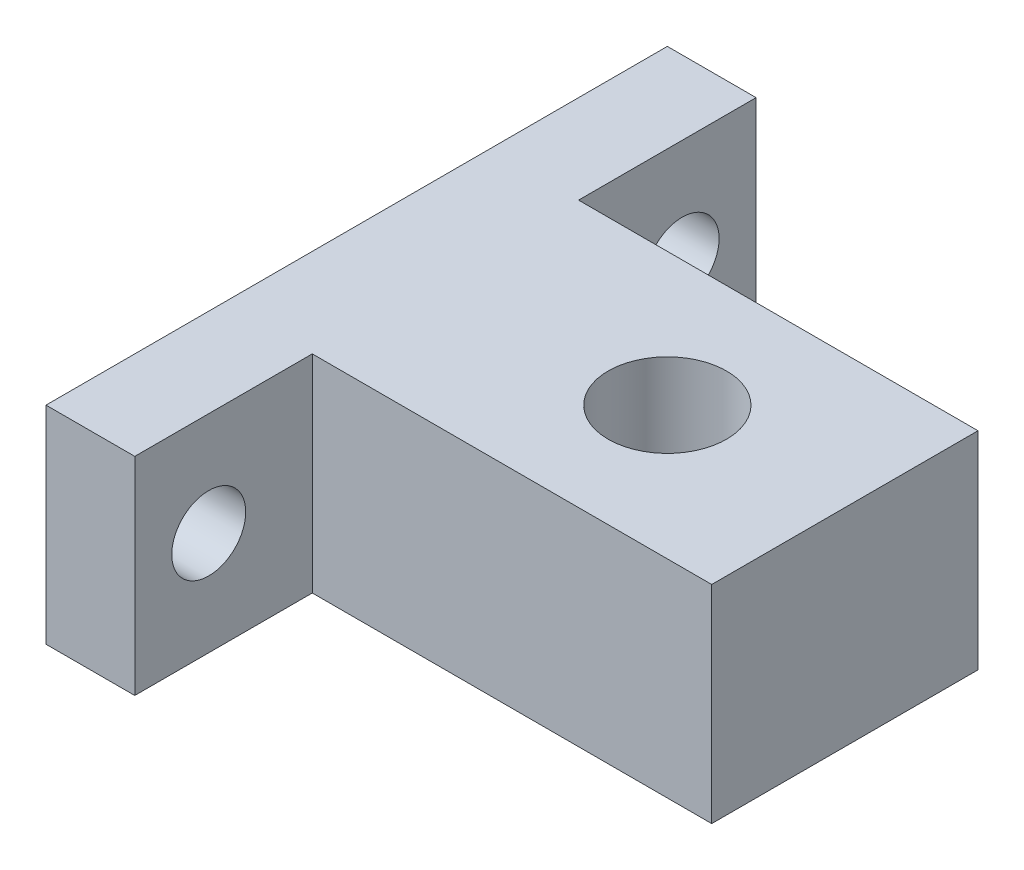
ISO-10303-21;
HEADER;
FILE_DESCRIPTION(('STEP AP214'),'2;1');
FILE_NAME('part.step','',(''),(''),'','','');
FILE_SCHEMA(('AUTOMOTIVE_DESIGN { 1 0 10303 214 1 1 1 1 }'));
ENDSEC;
DATA;
#1=APPLICATION_CONTEXT('core data for automotive mechanical design processes');
#2=APPLICATION_PROTOCOL_DEFINITION('international standard','automotive_design',2000,#1);
#3=PRODUCT_CONTEXT('',#1,'mechanical');
#4=PRODUCT('Part','Part','',(#3));
#5=PRODUCT_RELATED_PRODUCT_CATEGORY('part','',(#4));
#6=PRODUCT_DEFINITION_FORMATION('','',#4);
#7=PRODUCT_DEFINITION_CONTEXT('part definition',#1,'design');
#8=PRODUCT_DEFINITION('design','',#6,#7);
#9=PRODUCT_DEFINITION_SHAPE('','',#8);
#10=(LENGTH_UNIT() NAMED_UNIT(*) SI_UNIT(.MILLI.,.METRE.));
#11=(NAMED_UNIT(*) PLANE_ANGLE_UNIT() SI_UNIT($,.RADIAN.));
#12=(NAMED_UNIT(*) SI_UNIT($,.STERADIAN.) SOLID_ANGLE_UNIT());
#13=UNCERTAINTY_MEASURE_WITH_UNIT(LENGTH_MEASURE(1.E-05),#10,'distance_accuracy_value','');
#14=(GEOMETRIC_REPRESENTATION_CONTEXT(3) GLOBAL_UNCERTAINTY_ASSIGNED_CONTEXT((#13)) GLOBAL_UNIT_ASSIGNED_CONTEXT((#10,
#11,#12)) REPRESENTATION_CONTEXT('',''));
#15=CARTESIAN_POINT('',(0.,0.,0.));
#16=DIRECTION('',(0.,0.,1.));
#17=DIRECTION('',(1.,0.,0.));
#18=AXIS2_PLACEMENT_3D('',#15,#16,#17);
#19=CARTESIAN_POINT('',(0.,14.,0.));
#20=DIRECTION('',(0.,-1.,0.));
#21=DIRECTION('',(0.,0.,-1.));
#22=AXIS2_PLACEMENT_3D('',#19,#20,#21);
#23=PLANE('',#22);
#24=DIRECTION('',(0.,0.,1.));
#25=VECTOR('',#24,1.);
#26=CARTESIAN_POINT('',(-3.,14.,-21.));
#27=LINE('',#26,#25);
#28=CARTESIAN_POINT('',(-3.,14.,-21.));
#29=VERTEX_POINT('',#28);
#30=CARTESIAN_POINT('',(-3.,14.,21.));
#31=VERTEX_POINT('',#30);
#32=EDGE_CURVE('E148',#29,#31,#27,.T.);
#33=ORIENTED_EDGE('',*,*,#32,.T.);
#34=DIRECTION('',(1.,0.,0.));
#35=VECTOR('',#34,1.);
#36=CARTESIAN_POINT('',(3.,14.,21.));
#37=LINE('',#36,#35);
#38=CARTESIAN_POINT('',(3.,14.,21.));
#39=VERTEX_POINT('',#38);
#40=EDGE_CURVE('E96',#31,#39,#37,.T.);
#41=ORIENTED_EDGE('',*,*,#40,.T.);
#42=DIRECTION('',(0.,0.,-1.));
#43=VECTOR('',#42,1.);
#44=CARTESIAN_POINT('',(3.,14.,21.));
#45=LINE('',#44,#43);
#46=CARTESIAN_POINT('',(3.,14.,9.));
#47=VERTEX_POINT('',#46);
#48=EDGE_CURVE('E163',#39,#47,#45,.T.);
#49=ORIENTED_EDGE('',*,*,#48,.T.);
#50=DIRECTION('',(1.,0.,0.));
#51=VECTOR('',#50,1.);
#52=CARTESIAN_POINT('',(3.,14.,9.));
#53=LINE('',#52,#51);
#54=CARTESIAN_POINT('',(30.,14.,9.));
#55=VERTEX_POINT('',#54);
#56=EDGE_CURVE('E176',#47,#55,#53,.T.);
#57=ORIENTED_EDGE('',*,*,#56,.T.);
#58=DIRECTION('',(0.,0.,-1.));
#59=VECTOR('',#58,1.);
#60=CARTESIAN_POINT('',(30.,14.,9.));
#61=LINE('',#60,#59);
#62=CARTESIAN_POINT('',(30.,14.,-9.));
#63=VERTEX_POINT('',#62);
#64=EDGE_CURVE('E115',#55,#63,#61,.T.);
#65=ORIENTED_EDGE('',*,*,#64,.T.);
#66=DIRECTION('',(-1.,0.,0.));
#67=VECTOR('',#66,1.);
#68=CARTESIAN_POINT('',(3.,14.,-9.));
#69=LINE('',#68,#67);
#70=CARTESIAN_POINT('',(3.,14.,-9.));
#71=VERTEX_POINT('',#70);
#72=EDGE_CURVE('E109',#63,#71,#69,.T.);
#73=ORIENTED_EDGE('',*,*,#72,.T.);
#74=DIRECTION('',(0.,0.,-1.));
#75=VECTOR('',#74,1.);
#76=CARTESIAN_POINT('',(3.,14.,-21.));
#77=LINE('',#76,#75);
#78=CARTESIAN_POINT('',(3.,14.,-21.));
#79=VERTEX_POINT('',#78);
#80=EDGE_CURVE('E113',#71,#79,#77,.T.);
#81=ORIENTED_EDGE('',*,*,#80,.T.);
#82=DIRECTION('',(-1.,0.,0.));
#83=VECTOR('',#82,1.);
#84=CARTESIAN_POINT('',(3.,14.,-21.));
#85=LINE('',#84,#83);
#86=EDGE_CURVE('E53',#79,#29,#85,.T.);
#87=ORIENTED_EDGE('',*,*,#86,.T.);
#88=EDGE_LOOP('',(#33,#41,#49,#57,#65,#73,#81,#87));
#89=FACE_BOUND('',#88,.T.);
#90=CARTESIAN_POINT('',(18.,14.,0.));
#91=DIRECTION('',(0.,1.,0.));
#92=DIRECTION('',(0.,0.,1.));
#93=AXIS2_PLACEMENT_3D('',#90,#91,#92);
#94=CIRCLE('',#93,4.);
#95=CARTESIAN_POINT('',(18.,14.,4.));
#96=VERTEX_POINT('',#95);
#97=EDGE_CURVE('E137',#96,#96,#94,.T.);
#98=ORIENTED_EDGE('',*,*,#97,.F.);
#99=EDGE_LOOP('',(#98));
#100=FACE_BOUND('',#99,.T.);
#101=ADVANCED_FACE('F36',(#89,#100),#23,.F.);
#102=CARTESIAN_POINT('',(0.,0.,0.));
#103=DIRECTION('',(0.,-1.,0.));
#104=DIRECTION('',(0.,0.,-1.));
#105=AXIS2_PLACEMENT_3D('',#102,#103,#104);
#106=PLANE('',#105);
#107=DIRECTION('',(0.,0.,1.));
#108=VECTOR('',#107,1.);
#109=CARTESIAN_POINT('',(-3.,0.,-21.));
#110=LINE('',#109,#108);
#111=CARTESIAN_POINT('',(-3.,0.,-21.));
#112=VERTEX_POINT('',#111);
#113=CARTESIAN_POINT('',(-3.,0.,21.));
#114=VERTEX_POINT('',#113);
#115=EDGE_CURVE('E133',#112,#114,#110,.T.);
#116=ORIENTED_EDGE('',*,*,#115,.F.);
#117=DIRECTION('',(-1.,0.,0.));
#118=VECTOR('',#117,1.);
#119=CARTESIAN_POINT('',(3.,0.,-21.));
#120=LINE('',#119,#118);
#121=CARTESIAN_POINT('',(3.,0.,-21.));
#122=VERTEX_POINT('',#121);
#123=EDGE_CURVE('E88',#122,#112,#120,.T.);
#124=ORIENTED_EDGE('',*,*,#123,.F.);
#125=DIRECTION('',(0.,0.,-1.));
#126=VECTOR('',#125,1.);
#127=CARTESIAN_POINT('',(3.,0.,-21.));
#128=LINE('',#127,#126);
#129=CARTESIAN_POINT('',(3.,0.,-9.));
#130=VERTEX_POINT('',#129);
#131=EDGE_CURVE('E82',#130,#122,#128,.T.);
#132=ORIENTED_EDGE('',*,*,#131,.F.);
#133=DIRECTION('',(-1.,0.,0.));
#134=VECTOR('',#133,1.);
#135=CARTESIAN_POINT('',(3.,0.,-9.));
#136=LINE('',#135,#134);
#137=CARTESIAN_POINT('',(30.,0.,-9.));
#138=VERTEX_POINT('',#137);
#139=EDGE_CURVE('E123',#138,#130,#136,.T.);
#140=ORIENTED_EDGE('',*,*,#139,.F.);
#141=DIRECTION('',(0.,0.,-1.));
#142=VECTOR('',#141,1.);
#143=CARTESIAN_POINT('',(30.,0.,9.));
#144=LINE('',#143,#142);
#145=CARTESIAN_POINT('',(30.,0.,9.));
#146=VERTEX_POINT('',#145);
#147=EDGE_CURVE('E143',#146,#138,#144,.T.);
#148=ORIENTED_EDGE('',*,*,#147,.F.);
#149=DIRECTION('',(1.,0.,0.));
#150=VECTOR('',#149,1.);
#151=CARTESIAN_POINT('',(3.,0.,9.));
#152=LINE('',#151,#150);
#153=CARTESIAN_POINT('',(3.,0.,9.));
#154=VERTEX_POINT('',#153);
#155=EDGE_CURVE('E141',#154,#146,#152,.T.);
#156=ORIENTED_EDGE('',*,*,#155,.F.);
#157=DIRECTION('',(0.,0.,-1.));
#158=VECTOR('',#157,1.);
#159=CARTESIAN_POINT('',(3.,0.,21.));
#160=LINE('',#159,#158);
#161=CARTESIAN_POINT('',(3.,0.,21.));
#162=VERTEX_POINT('',#161);
#163=EDGE_CURVE('E139',#162,#154,#160,.T.);
#164=ORIENTED_EDGE('',*,*,#163,.F.);
#165=DIRECTION('',(1.,0.,0.));
#166=VECTOR('',#165,1.);
#167=CARTESIAN_POINT('',(3.,0.,21.));
#168=LINE('',#167,#166);
#169=EDGE_CURVE('E136',#114,#162,#168,.T.);
#170=ORIENTED_EDGE('',*,*,#169,.F.);
#171=EDGE_LOOP('',(#116,#124,#132,#140,#148,#156,#164,#170));
#172=FACE_BOUND('',#171,.T.);
#173=CARTESIAN_POINT('',(18.,0.,0.));
#174=DIRECTION('',(0.,1.,0.));
#175=DIRECTION('',(0.,0.,1.));
#176=AXIS2_PLACEMENT_3D('',#173,#174,#175);
#177=CIRCLE('',#176,4.);
#178=CARTESIAN_POINT('',(18.,0.,4.));
#179=VERTEX_POINT('',#178);
#180=EDGE_CURVE('E182',#179,#179,#177,.T.);
#181=ORIENTED_EDGE('',*,*,#180,.T.);
#182=EDGE_LOOP('',(#181));
#183=FACE_BOUND('',#182,.T.);
#184=ADVANCED_FACE('F167',(#172,#183),#106,.T.);
#185=CARTESIAN_POINT('',(-3.,14.,-21.));
#186=DIRECTION('',(1.,0.,0.));
#187=DIRECTION('',(0.,0.,-1.));
#188=AXIS2_PLACEMENT_3D('',#185,#186,#187);
#189=PLANE('',#188);
#190=CARTESIAN_POINT('',(-3.,7.,-16.));
#191=DIRECTION('',(1.,0.,0.));
#192=DIRECTION('',(0.,0.,-1.));
#193=AXIS2_PLACEMENT_3D('',#190,#191,#192);
#194=CIRCLE('',#193,2.49999999999999);
#195=CARTESIAN_POINT('',(-3.,7.,-18.5));
#196=VERTEX_POINT('',#195);
#197=EDGE_CURVE('E193',#196,#196,#194,.T.);
#198=ORIENTED_EDGE('',*,*,#197,.T.);
#199=EDGE_LOOP('',(#198));
#200=FACE_BOUND('',#199,.T.);
#201=CARTESIAN_POINT('',(-3.,7.,16.));
#202=DIRECTION('',(1.,0.,0.));
#203=DIRECTION('',(0.,0.,-1.));
#204=AXIS2_PLACEMENT_3D('',#201,#202,#203);
#205=CIRCLE('',#204,2.5);
#206=CARTESIAN_POINT('',(-3.,7.,13.5));
#207=VERTEX_POINT('',#206);
#208=EDGE_CURVE('E185',#207,#207,#205,.T.);
#209=ORIENTED_EDGE('',*,*,#208,.T.);
#210=EDGE_LOOP('',(#209));
#211=FACE_BOUND('',#210,.T.);
#212=ORIENTED_EDGE('',*,*,#115,.T.);
#213=DIRECTION('',(0.,-1.,0.));
#214=VECTOR('',#213,1.);
#215=CARTESIAN_POINT('',(-3.,14.,21.));
#216=LINE('',#215,#214);
#217=EDGE_CURVE('E11',#31,#114,#216,.T.);
#218=ORIENTED_EDGE('',*,*,#217,.F.);
#219=ORIENTED_EDGE('',*,*,#32,.F.);
#220=DIRECTION('',(0.,-1.,0.));
#221=VECTOR('',#220,1.);
#222=CARTESIAN_POINT('',(-3.,14.,-21.));
#223=LINE('',#222,#221);
#224=EDGE_CURVE('E129',#29,#112,#223,.T.);
#225=ORIENTED_EDGE('',*,*,#224,.T.);
#226=EDGE_LOOP('',(#212,#218,#219,#225));
#227=FACE_BOUND('',#226,.T.);
#228=ADVANCED_FACE('F38',(#200,#211,#227),#189,.F.);
#229=CARTESIAN_POINT('',(3.,14.,21.));
#230=DIRECTION('',(0.,0.,-1.));
#231=DIRECTION('',(-1.,0.,0.));
#232=AXIS2_PLACEMENT_3D('',#229,#230,#231);
#233=PLANE('',#232);
#234=ORIENTED_EDGE('',*,*,#169,.T.);
#235=DIRECTION('',(0.,-1.,0.));
#236=VECTOR('',#235,1.);
#237=CARTESIAN_POINT('',(3.,14.,21.));
#238=LINE('',#237,#236);
#239=EDGE_CURVE('E45',#39,#162,#238,.T.);
#240=ORIENTED_EDGE('',*,*,#239,.F.);
#241=ORIENTED_EDGE('',*,*,#40,.F.);
#242=ORIENTED_EDGE('',*,*,#217,.T.);
#243=EDGE_LOOP('',(#234,#240,#241,#242));
#244=FACE_BOUND('',#243,.T.);
#245=ADVANCED_FACE('F273',(#244),#233,.F.);
#246=CARTESIAN_POINT('',(3.,14.,21.));
#247=DIRECTION('',(-1.,0.,0.));
#248=DIRECTION('',(0.,0.,1.));
#249=AXIS2_PLACEMENT_3D('',#246,#247,#248);
#250=PLANE('',#249);
#251=CARTESIAN_POINT('',(3.,7.,16.));
#252=DIRECTION('',(1.,0.,0.));
#253=DIRECTION('',(0.,0.,-1.));
#254=AXIS2_PLACEMENT_3D('',#251,#252,#253);
#255=CIRCLE('',#254,2.5);
#256=CARTESIAN_POINT('',(3.,7.,13.5));
#257=VERTEX_POINT('',#256);
#258=EDGE_CURVE('E190',#257,#257,#255,.T.);
#259=ORIENTED_EDGE('',*,*,#258,.F.);
#260=EDGE_LOOP('',(#259));
#261=FACE_BOUND('',#260,.T.);
#262=ORIENTED_EDGE('',*,*,#163,.T.);
#263=DIRECTION('',(0.,-1.,0.));
#264=VECTOR('',#263,1.);
#265=CARTESIAN_POINT('',(3.,14.,9.));
#266=LINE('',#265,#264);
#267=EDGE_CURVE('E155',#47,#154,#266,.T.);
#268=ORIENTED_EDGE('',*,*,#267,.F.);
#269=ORIENTED_EDGE('',*,*,#48,.F.);
#270=ORIENTED_EDGE('',*,*,#239,.T.);
#271=EDGE_LOOP('',(#262,#268,#269,#270));
#272=FACE_BOUND('',#271,.T.);
#273=ADVANCED_FACE('F161',(#261,#272),#250,.F.);
#274=CARTESIAN_POINT('',(3.,14.,9.));
#275=DIRECTION('',(0.,0.,-1.));
#276=DIRECTION('',(-1.,0.,0.));
#277=AXIS2_PLACEMENT_3D('',#274,#275,#276);
#278=PLANE('',#277);
#279=ORIENTED_EDGE('',*,*,#155,.T.);
#280=DIRECTION('',(0.,-1.,0.));
#281=VECTOR('',#280,1.);
#282=CARTESIAN_POINT('',(30.,14.,9.));
#283=LINE('',#282,#281);
#284=EDGE_CURVE('E152',#55,#146,#283,.T.);
#285=ORIENTED_EDGE('',*,*,#284,.F.);
#286=ORIENTED_EDGE('',*,*,#56,.F.);
#287=ORIENTED_EDGE('',*,*,#267,.T.);
#288=EDGE_LOOP('',(#279,#285,#286,#287));
#289=FACE_BOUND('',#288,.T.);
#290=ADVANCED_FACE('F172',(#289),#278,.F.);
#291=CARTESIAN_POINT('',(30.,14.,9.));
#292=DIRECTION('',(-1.,0.,0.));
#293=DIRECTION('',(0.,0.,1.));
#294=AXIS2_PLACEMENT_3D('',#291,#292,#293);
#295=PLANE('',#294);
#296=ORIENTED_EDGE('',*,*,#147,.T.);
#297=DIRECTION('',(0.,-1.,0.));
#298=VECTOR('',#297,1.);
#299=CARTESIAN_POINT('',(30.,14.,-9.));
#300=LINE('',#299,#298);
#301=EDGE_CURVE('E124',#63,#138,#300,.T.);
#302=ORIENTED_EDGE('',*,*,#301,.F.);
#303=ORIENTED_EDGE('',*,*,#64,.F.);
#304=ORIENTED_EDGE('',*,*,#284,.T.);
#305=EDGE_LOOP('',(#296,#302,#303,#304));
#306=FACE_BOUND('',#305,.T.);
#307=ADVANCED_FACE('F175',(#306),#295,.F.);
#308=CARTESIAN_POINT('',(3.,14.,-9.));
#309=DIRECTION('',(0.,0.,1.));
#310=DIRECTION('',(1.,0.,0.));
#311=AXIS2_PLACEMENT_3D('',#308,#309,#310);
#312=PLANE('',#311);
#313=ORIENTED_EDGE('',*,*,#139,.T.);
#314=DIRECTION('',(0.,-1.,0.));
#315=VECTOR('',#314,1.);
#316=CARTESIAN_POINT('',(3.,14.,-9.));
#317=LINE('',#316,#315);
#318=EDGE_CURVE('E120',#71,#130,#317,.T.);
#319=ORIENTED_EDGE('',*,*,#318,.F.);
#320=ORIENTED_EDGE('',*,*,#72,.F.);
#321=ORIENTED_EDGE('',*,*,#301,.T.);
#322=EDGE_LOOP('',(#313,#319,#320,#321));
#323=FACE_BOUND('',#322,.T.);
#324=ADVANCED_FACE('F121',(#323),#312,.F.);
#325=CARTESIAN_POINT('',(3.,14.,-21.));
#326=DIRECTION('',(-1.,0.,0.));
#327=DIRECTION('',(0.,0.,1.));
#328=AXIS2_PLACEMENT_3D('',#325,#326,#327);
#329=PLANE('',#328);
#330=CARTESIAN_POINT('',(3.,7.,-16.));
#331=DIRECTION('',(1.,0.,0.));
#332=DIRECTION('',(0.,0.,-1.));
#333=AXIS2_PLACEMENT_3D('',#330,#331,#332);
#334=CIRCLE('',#333,2.49999999999999);
#335=CARTESIAN_POINT('',(3.,7.,-18.5));
#336=VERTEX_POINT('',#335);
#337=EDGE_CURVE('E196',#336,#336,#334,.T.);
#338=ORIENTED_EDGE('',*,*,#337,.F.);
#339=EDGE_LOOP('',(#338));
#340=FACE_BOUND('',#339,.T.);
#341=ORIENTED_EDGE('',*,*,#131,.T.);
#342=DIRECTION('',(0.,-1.,0.));
#343=VECTOR('',#342,1.);
#344=CARTESIAN_POINT('',(3.,14.,-21.));
#345=LINE('',#344,#343);
#346=EDGE_CURVE('E125',#79,#122,#345,.T.);
#347=ORIENTED_EDGE('',*,*,#346,.F.);
#348=ORIENTED_EDGE('',*,*,#80,.F.);
#349=ORIENTED_EDGE('',*,*,#318,.T.);
#350=EDGE_LOOP('',(#341,#347,#348,#349));
#351=FACE_BOUND('',#350,.T.);
#352=ADVANCED_FACE('F127',(#340,#351),#329,.F.);
#353=CARTESIAN_POINT('',(3.,14.,-21.));
#354=DIRECTION('',(0.,0.,1.));
#355=DIRECTION('',(1.,0.,0.));
#356=AXIS2_PLACEMENT_3D('',#353,#354,#355);
#357=PLANE('',#356);
#358=ORIENTED_EDGE('',*,*,#123,.T.);
#359=ORIENTED_EDGE('',*,*,#224,.F.);
#360=ORIENTED_EDGE('',*,*,#86,.F.);
#361=ORIENTED_EDGE('',*,*,#346,.T.);
#362=EDGE_LOOP('',(#358,#359,#360,#361));
#363=FACE_BOUND('',#362,.T.);
#364=ADVANCED_FACE('F204',(#363),#357,.F.);
#365=CARTESIAN_POINT('',(18.,14.,0.));
#366=DIRECTION('',(0.,-1.,0.));
#367=DIRECTION('',(0.,0.,-1.));
#368=AXIS2_PLACEMENT_3D('',#365,#366,#367);
#369=CYLINDRICAL_SURFACE('',#368,4.);
#370=ORIENTED_EDGE('',*,*,#97,.T.);
#371=EDGE_LOOP('',(#370));
#372=FACE_BOUND('',#371,.T.);
#373=ORIENTED_EDGE('',*,*,#180,.F.);
#374=EDGE_LOOP('',(#373));
#375=FACE_BOUND('',#374,.T.);
#376=ADVANCED_FACE('F210',(#372,#375),#369,.F.);
#377=CARTESIAN_POINT('',(-7.,7.,16.));
#378=DIRECTION('',(1.,0.,0.));
#379=DIRECTION('',(0.,0.,-1.));
#380=AXIS2_PLACEMENT_3D('',#377,#378,#379);
#381=CYLINDRICAL_SURFACE('',#380,2.5);
#382=ORIENTED_EDGE('',*,*,#258,.T.);
#383=EDGE_LOOP('',(#382));
#384=FACE_BOUND('',#383,.T.);
#385=ORIENTED_EDGE('',*,*,#208,.F.);
#386=EDGE_LOOP('',(#385));
#387=FACE_BOUND('',#386,.T.);
#388=ADVANCED_FACE('F222',(#384,#387),#381,.F.);
#389=CARTESIAN_POINT('',(-7.,7.,-16.));
#390=DIRECTION('',(1.,0.,0.));
#391=DIRECTION('',(0.,0.,-1.));
#392=AXIS2_PLACEMENT_3D('',#389,#390,#391);
#393=CYLINDRICAL_SURFACE('',#392,2.49999999999999);
#394=ORIENTED_EDGE('',*,*,#337,.T.);
#395=EDGE_LOOP('',(#394));
#396=FACE_BOUND('',#395,.T.);
#397=ORIENTED_EDGE('',*,*,#197,.F.);
#398=EDGE_LOOP('',(#397));
#399=FACE_BOUND('',#398,.T.);
#400=ADVANCED_FACE('F200',(#396,#399),#393,.F.);
#401=CLOSED_SHELL('',(#101,#184,#228,#245,#273,#290,#307,#324,#352,#364,#376,#388,#400));
#402=MANIFOLD_SOLID_BREP('B2',#401);
#403=ADVANCED_BREP_SHAPE_REPRESENTATION('',(#18,#402),#14);
#404=SHAPE_DEFINITION_REPRESENTATION(#9,#403);
ENDSEC;
END-ISO-10303-21;
